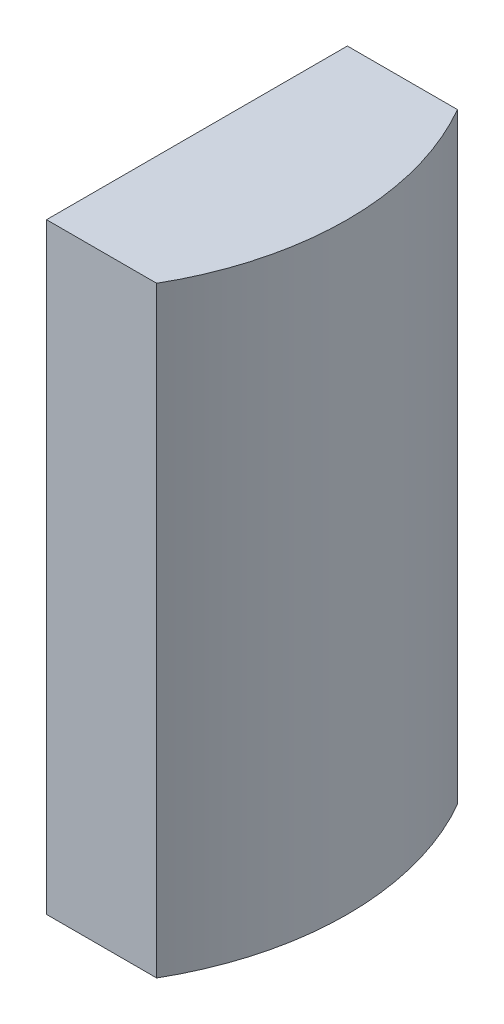
ISO-10303-21;
HEADER;
FILE_DESCRIPTION(('STEP AP214'),'2;1');
FILE_NAME('part.step','',(''),(''),'','','');
FILE_SCHEMA(('AUTOMOTIVE_DESIGN { 1 0 10303 214 1 1 1 1 }'));
ENDSEC;
DATA;
#1=APPLICATION_CONTEXT('core data for automotive mechanical design processes');
#2=APPLICATION_PROTOCOL_DEFINITION('international standard','automotive_design',2000,#1);
#3=PRODUCT_CONTEXT('',#1,'mechanical');
#4=PRODUCT('Part','Part','',(#3));
#5=PRODUCT_RELATED_PRODUCT_CATEGORY('part','',(#4));
#6=PRODUCT_DEFINITION_FORMATION('','',#4);
#7=PRODUCT_DEFINITION_CONTEXT('part definition',#1,'design');
#8=PRODUCT_DEFINITION('design','',#6,#7);
#9=PRODUCT_DEFINITION_SHAPE('','',#8);
#10=(LENGTH_UNIT() NAMED_UNIT(*) SI_UNIT(.MILLI.,.METRE.));
#11=(NAMED_UNIT(*) PLANE_ANGLE_UNIT() SI_UNIT($,.RADIAN.));
#12=(NAMED_UNIT(*) SI_UNIT($,.STERADIAN.) SOLID_ANGLE_UNIT());
#13=UNCERTAINTY_MEASURE_WITH_UNIT(LENGTH_MEASURE(1.E-05),#10,'distance_accuracy_value','');
#14=(GEOMETRIC_REPRESENTATION_CONTEXT(3) GLOBAL_UNCERTAINTY_ASSIGNED_CONTEXT((#13)) GLOBAL_UNIT_ASSIGNED_CONTEXT((#10,
#11,#12)) REPRESENTATION_CONTEXT('',''));
#15=CARTESIAN_POINT('',(0.,0.,0.));
#16=DIRECTION('',(0.,0.,1.));
#17=DIRECTION('',(1.,0.,0.));
#18=AXIS2_PLACEMENT_3D('',#15,#16,#17);
#19=CARTESIAN_POINT('',(1.00122029676449,4.,0.));
#20=DIRECTION('',(0.,0.,-1.));
#21=DIRECTION('',(-1.,0.,0.));
#22=AXIS2_PLACEMENT_3D('',#19,#20,#21);
#23=PLANE('',#22);
#24=DIRECTION('',(1.,0.,0.));
#25=VECTOR('',#24,1.);
#26=CARTESIAN_POINT('',(1.00122029676449,0.,0.));
#27=LINE('',#26,#25);
#28=CARTESIAN_POINT('',(1.00122029676449,0.,0.));
#29=VERTEX_POINT('',#28);
#30=CARTESIAN_POINT('',(1.73327277924743,0.,0.));
#31=VERTEX_POINT('',#30);
#32=EDGE_CURVE('E98',#29,#31,#27,.T.);
#33=ORIENTED_EDGE('',*,*,#32,.T.);
#34=DIRECTION('',(0.,-1.,0.));
#35=VECTOR('',#34,1.);
#36=CARTESIAN_POINT('',(1.73327277924743,4.,0.));
#37=LINE('',#36,#35);
#38=CARTESIAN_POINT('',(1.73327277924743,4.,0.));
#39=VERTEX_POINT('',#38);
#40=EDGE_CURVE('E11',#39,#31,#37,.T.);
#41=ORIENTED_EDGE('',*,*,#40,.F.);
#42=DIRECTION('',(1.,0.,0.));
#43=VECTOR('',#42,1.);
#44=CARTESIAN_POINT('',(1.00122029676449,4.,0.));
#45=LINE('',#44,#43);
#46=CARTESIAN_POINT('',(1.00122029676449,4.,0.));
#47=VERTEX_POINT('',#46);
#48=EDGE_CURVE('E86',#47,#39,#45,.T.);
#49=ORIENTED_EDGE('',*,*,#48,.F.);
#50=DIRECTION('',(0.,-1.,0.));
#51=VECTOR('',#50,1.);
#52=CARTESIAN_POINT('',(1.00122029676449,4.,0.));
#53=LINE('',#52,#51);
#54=EDGE_CURVE('E94',#47,#29,#53,.T.);
#55=ORIENTED_EDGE('',*,*,#54,.T.);
#56=EDGE_LOOP('',(#33,#41,#49,#55));
#57=FACE_BOUND('',#56,.T.);
#58=ADVANCED_FACE('F35',(#57),#23,.F.);
#59=CARTESIAN_POINT('',(0.,4.,-1.));
#60=DIRECTION('',(0.,-1.,0.));
#61=DIRECTION('',(0.,0.,-1.));
#62=AXIS2_PLACEMENT_3D('',#59,#60,#61);
#63=CYLINDRICAL_SURFACE('',#62,2.0010583517929);
#64=CARTESIAN_POINT('',(0.,0.,-1.));
#65=DIRECTION('',(0.,1.,0.));
#66=DIRECTION('',(0.,0.,1.));
#67=AXIS2_PLACEMENT_3D('',#64,#65,#66);
#68=CIRCLE('',#67,2.0010583517929);
#69=CARTESIAN_POINT('',(1.73327277924743,0.,-2.));
#70=VERTEX_POINT('',#69);
#71=EDGE_CURVE('E90',#31,#70,#68,.T.);
#72=ORIENTED_EDGE('',*,*,#71,.T.);
#73=DIRECTION('',(0.,-1.,0.));
#74=VECTOR('',#73,1.);
#75=CARTESIAN_POINT('',(1.73327277924743,4.,-2.));
#76=LINE('',#75,#74);
#77=CARTESIAN_POINT('',(1.73327277924743,4.,-2.));
#78=VERTEX_POINT('',#77);
#79=EDGE_CURVE('E43',#78,#70,#76,.T.);
#80=ORIENTED_EDGE('',*,*,#79,.F.);
#81=CARTESIAN_POINT('',(0.,4.,-1.));
#82=DIRECTION('',(0.,1.,0.));
#83=DIRECTION('',(0.,0.,1.));
#84=AXIS2_PLACEMENT_3D('',#81,#82,#83);
#85=CIRCLE('',#84,2.0010583517929);
#86=EDGE_CURVE('E81',#39,#78,#85,.T.);
#87=ORIENTED_EDGE('',*,*,#86,.F.);
#88=ORIENTED_EDGE('',*,*,#40,.T.);
#89=EDGE_LOOP('',(#72,#80,#87,#88));
#90=FACE_BOUND('',#89,.T.);
#91=ADVANCED_FACE('F89',(#90),#63,.T.);
#92=CARTESIAN_POINT('',(1.00122029676449,4.,-2.));
#93=DIRECTION('',(0.,0.,1.));
#94=DIRECTION('',(1.,0.,0.));
#95=AXIS2_PLACEMENT_3D('',#92,#93,#94);
#96=PLANE('',#95);
#97=DIRECTION('',(-1.,0.,0.));
#98=VECTOR('',#97,1.);
#99=CARTESIAN_POINT('',(1.00122029676449,0.,-2.));
#100=LINE('',#99,#98);
#101=CARTESIAN_POINT('',(1.00122029676449,0.,-2.));
#102=VERTEX_POINT('',#101);
#103=EDGE_CURVE('E68',#70,#102,#100,.T.);
#104=ORIENTED_EDGE('',*,*,#103,.T.);
#105=DIRECTION('',(0.,-1.,0.));
#106=VECTOR('',#105,1.);
#107=CARTESIAN_POINT('',(1.00122029676449,4.,-2.));
#108=LINE('',#107,#106);
#109=CARTESIAN_POINT('',(1.00122029676449,4.,-2.));
#110=VERTEX_POINT('',#109);
#111=EDGE_CURVE('E91',#110,#102,#108,.T.);
#112=ORIENTED_EDGE('',*,*,#111,.F.);
#113=DIRECTION('',(-1.,0.,0.));
#114=VECTOR('',#113,1.);
#115=CARTESIAN_POINT('',(1.00122029676449,4.,-2.));
#116=LINE('',#115,#114);
#117=EDGE_CURVE('E84',#78,#110,#116,.T.);
#118=ORIENTED_EDGE('',*,*,#117,.F.);
#119=ORIENTED_EDGE('',*,*,#79,.T.);
#120=EDGE_LOOP('',(#104,#112,#118,#119));
#121=FACE_BOUND('',#120,.T.);
#122=ADVANCED_FACE('F92',(#121),#96,.F.);
#123=CARTESIAN_POINT('',(1.00122029676449,4.,-2.));
#124=DIRECTION('',(1.,0.,0.));
#125=DIRECTION('',(0.,0.,-1.));
#126=AXIS2_PLACEMENT_3D('',#123,#124,#125);
#127=PLANE('',#126);
#128=DIRECTION('',(0.,0.,1.));
#129=VECTOR('',#128,1.);
#130=CARTESIAN_POINT('',(1.00122029676449,0.,-2.));
#131=LINE('',#130,#129);
#132=EDGE_CURVE('E74',#102,#29,#131,.T.);
#133=ORIENTED_EDGE('',*,*,#132,.T.);
#134=ORIENTED_EDGE('',*,*,#54,.F.);
#135=DIRECTION('',(0.,0.,1.));
#136=VECTOR('',#135,1.);
#137=CARTESIAN_POINT('',(1.00122029676449,4.,-2.));
#138=LINE('',#137,#136);
#139=EDGE_CURVE('E51',#110,#47,#138,.T.);
#140=ORIENTED_EDGE('',*,*,#139,.F.);
#141=ORIENTED_EDGE('',*,*,#111,.T.);
#142=EDGE_LOOP('',(#133,#134,#140,#141));
#143=FACE_BOUND('',#142,.T.);
#144=ADVANCED_FACE('F105',(#143),#127,.F.);
#145=CARTESIAN_POINT('',(0.,4.,-1.));
#146=DIRECTION('',(0.,1.,0.));
#147=DIRECTION('',(0.,0.,1.));
#148=AXIS2_PLACEMENT_3D('',#145,#146,#147);
#149=PLANE('',#148);
#150=ORIENTED_EDGE('',*,*,#48,.T.);
#151=ORIENTED_EDGE('',*,*,#86,.T.);
#152=ORIENTED_EDGE('',*,*,#117,.T.);
#153=ORIENTED_EDGE('',*,*,#139,.T.);
#154=EDGE_LOOP('',(#150,#151,#152,#153));
#155=FACE_BOUND('',#154,.T.);
#156=ADVANCED_FACE('F82',(#155),#149,.T.);
#157=CARTESIAN_POINT('',(0.,0.,-1.));
#158=DIRECTION('',(0.,1.,0.));
#159=DIRECTION('',(0.,0.,1.));
#160=AXIS2_PLACEMENT_3D('',#157,#158,#159);
#161=PLANE('',#160);
#162=ORIENTED_EDGE('',*,*,#32,.F.);
#163=ORIENTED_EDGE('',*,*,#132,.F.);
#164=ORIENTED_EDGE('',*,*,#103,.F.);
#165=ORIENTED_EDGE('',*,*,#71,.F.);
#166=EDGE_LOOP('',(#162,#163,#164,#165));
#167=FACE_BOUND('',#166,.T.);
#168=ADVANCED_FACE('F108',(#167),#161,.F.);
#169=CLOSED_SHELL('',(#58,#91,#122,#144,#156,#168));
#170=MANIFOLD_SOLID_BREP('B2',#169);
#171=ADVANCED_BREP_SHAPE_REPRESENTATION('',(#18,#170),#14);
#172=SHAPE_DEFINITION_REPRESENTATION(#9,#171);
ENDSEC;
END-ISO-10303-21;
